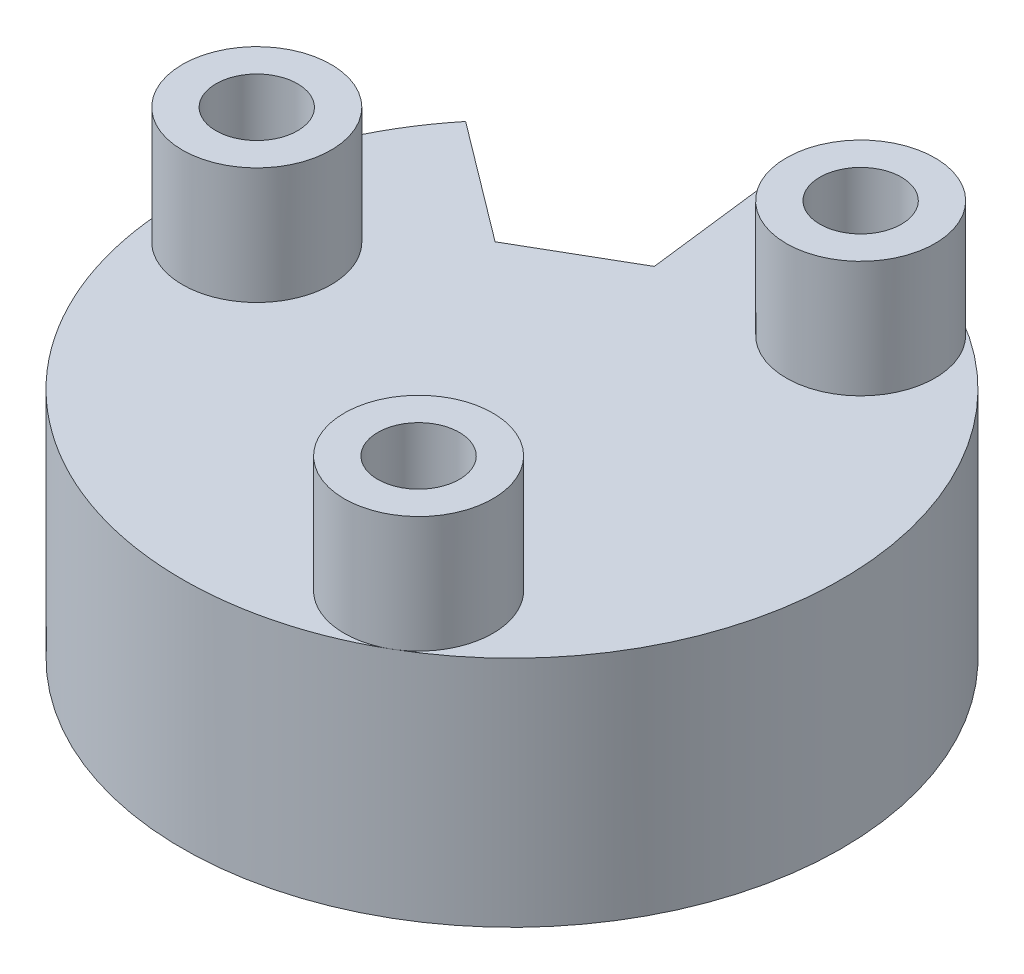
ISO-10303-21;
HEADER;
FILE_DESCRIPTION(('STEP AP214'),'2;1');
FILE_NAME('part.step','',(''),(''),'','','');
FILE_SCHEMA(('AUTOMOTIVE_DESIGN { 1 0 10303 214 1 1 1 1 }'));
ENDSEC;
DATA;
#1=APPLICATION_CONTEXT('core data for automotive mechanical design processes');
#2=APPLICATION_PROTOCOL_DEFINITION('international standard','automotive_design',2000,#1);
#3=PRODUCT_CONTEXT('',#1,'mechanical');
#4=PRODUCT('Part','Part','',(#3));
#5=PRODUCT_RELATED_PRODUCT_CATEGORY('part','',(#4));
#6=PRODUCT_DEFINITION_FORMATION('','',#4);
#7=PRODUCT_DEFINITION_CONTEXT('part definition',#1,'design');
#8=PRODUCT_DEFINITION('design','',#6,#7);
#9=PRODUCT_DEFINITION_SHAPE('','',#8);
#10=(LENGTH_UNIT() NAMED_UNIT(*) SI_UNIT(.MILLI.,.METRE.));
#11=(NAMED_UNIT(*) PLANE_ANGLE_UNIT() SI_UNIT($,.RADIAN.));
#12=(NAMED_UNIT(*) SI_UNIT($,.STERADIAN.) SOLID_ANGLE_UNIT());
#13=UNCERTAINTY_MEASURE_WITH_UNIT(LENGTH_MEASURE(1.E-05),#10,'distance_accuracy_value','');
#14=(GEOMETRIC_REPRESENTATION_CONTEXT(3) GLOBAL_UNCERTAINTY_ASSIGNED_CONTEXT((#13)) GLOBAL_UNIT_ASSIGNED_CONTEXT((#10,
#11,#12)) REPRESENTATION_CONTEXT('',''));
#15=CARTESIAN_POINT('',(0.,0.,0.));
#16=DIRECTION('',(0.,0.,1.));
#17=DIRECTION('',(1.,0.,0.));
#18=AXIS2_PLACEMENT_3D('',#15,#16,#17);
#19=CARTESIAN_POINT('',(0.,20.,0.));
#20=DIRECTION('',(0.,-1.,0.));
#21=DIRECTION('',(0.,0.,-1.));
#22=AXIS2_PLACEMENT_3D('',#19,#20,#21);
#23=CYLINDRICAL_SURFACE('',#22,28.275);
#24=CARTESIAN_POINT('',(0.,0.,0.));
#25=DIRECTION('',(0.,1.,0.));
#26=DIRECTION('',(0.,0.,1.));
#27=AXIS2_PLACEMENT_3D('',#24,#25,#26);
#28=CIRCLE('',#27,28.275);
#29=CARTESIAN_POINT('',(-21.8840547868726,0.,-17.9042947664843));
#30=VERTEX_POINT('',#29);
#31=CARTESIAN_POINT('',(-4.56354671118386,0.,-27.9042947664843));
#32=VERTEX_POINT('',#31);
#33=EDGE_CURVE('E153',#30,#32,#28,.T.);
#34=ORIENTED_EDGE('',*,*,#33,.T.);
#35=DIRECTION('',(0.,-1.,0.));
#36=VECTOR('',#35,1.);
#37=CARTESIAN_POINT('',(-4.56354671118386,20.,-27.9042947664843));
#38=LINE('',#37,#36);
#39=CARTESIAN_POINT('',(-4.56354671118386,20.,-27.9042947664843));
#40=VERTEX_POINT('',#39);
#41=EDGE_CURVE('E11',#40,#32,#38,.T.);
#42=ORIENTED_EDGE('',*,*,#41,.F.);
#43=CARTESIAN_POINT('',(0.,20.,0.));
#44=DIRECTION('',(0.,1.,0.));
#45=DIRECTION('',(0.,0.,1.));
#46=AXIS2_PLACEMENT_3D('',#43,#44,#45);
#47=CIRCLE('',#46,28.275);
#48=CARTESIAN_POINT('',(14.1375,20.,-24.486868292005));
#49=VERTEX_POINT('',#48);
#50=EDGE_CURVE('E184',#49,#40,#47,.T.);
#51=ORIENTED_EDGE('',*,*,#50,.F.);
#52=CARTESIAN_POINT('',(14.1375,20.,24.486868292005));
#53=VERTEX_POINT('',#52);
#54=EDGE_CURVE('E162',#53,#49,#47,.T.);
#55=ORIENTED_EDGE('',*,*,#54,.F.);
#56=CARTESIAN_POINT('',(-28.275,20.,0.));
#57=VERTEX_POINT('',#56);
#58=EDGE_CURVE('E161',#57,#53,#47,.T.);
#59=ORIENTED_EDGE('',*,*,#58,.F.);
#60=CARTESIAN_POINT('',(-21.8840547868726,20.,-17.9042947664843));
#61=VERTEX_POINT('',#60);
#62=EDGE_CURVE('E157',#61,#57,#47,.T.);
#63=ORIENTED_EDGE('',*,*,#62,.F.);
#64=DIRECTION('',(0.,-1.,0.));
#65=VECTOR('',#64,1.);
#66=CARTESIAN_POINT('',(-21.8840547868726,20.,-17.9042947664843));
#67=LINE('',#66,#65);
#68=EDGE_CURVE('E171',#61,#30,#67,.T.);
#69=ORIENTED_EDGE('',*,*,#68,.T.);
#70=EDGE_LOOP('',(#34,#42,#51,#55,#59,#63,#69));
#71=FACE_BOUND('',#70,.T.);
#72=ADVANCED_FACE('F45',(#71),#23,.T.);
#73=CARTESIAN_POINT('',(-4.56354671118386,20.,-27.9042947664843));
#74=DIRECTION('',(0.992655646154147,0.,-0.120974245847179));
#75=DIRECTION('',(-0.120974245847179,0.,-0.992655646154147));
#76=AXIS2_PLACEMENT_3D('',#73,#74,#75);
#77=PLANE('',#76);
#78=DIRECTION('',(0.120974245847179,0.,0.992655646154146));
#79=VECTOR('',#78,1.);
#80=CARTESIAN_POINT('',(-4.56354671118386,0.,-27.9042947664843));
#81=LINE('',#80,#79);
#82=CARTESIAN_POINT('',(-3.01877808660203,0.,-15.2286770227703));
#83=VERTEX_POINT('',#82);
#84=EDGE_CURVE('E175',#32,#83,#81,.T.);
#85=ORIENTED_EDGE('',*,*,#84,.T.);
#86=DIRECTION('',(0.,-1.,0.));
#87=VECTOR('',#86,1.);
#88=CARTESIAN_POINT('',(-3.01877808660203,20.,-15.2286770227703));
#89=LINE('',#88,#87);
#90=CARTESIAN_POINT('',(-3.01877808660203,20.,-15.2286770227703));
#91=VERTEX_POINT('',#90);
#92=EDGE_CURVE('E53',#91,#83,#89,.T.);
#93=ORIENTED_EDGE('',*,*,#92,.F.);
#94=DIRECTION('',(0.120974245847179,0.,0.992655646154146));
#95=VECTOR('',#94,1.);
#96=CARTESIAN_POINT('',(-4.56354671118386,20.,-27.9042947664843));
#97=LINE('',#96,#95);
#98=EDGE_CURVE('E160',#40,#91,#97,.T.);
#99=ORIENTED_EDGE('',*,*,#98,.F.);
#100=ORIENTED_EDGE('',*,*,#41,.T.);
#101=EDGE_LOOP('',(#85,#93,#99,#100));
#102=FACE_BOUND('',#101,.T.);
#103=ADVANCED_FACE('F220',(#102),#77,.F.);
#104=CARTESIAN_POINT('',(-11.6790321244464,20.,-10.2286770227703));
#105=DIRECTION('',(0.5,0.,0.866025403784439));
#106=DIRECTION('',(0.866025403784439,0.,-0.5));
#107=AXIS2_PLACEMENT_3D('',#104,#105,#106);
#108=PLANE('',#107);
#109=CARTESIAN_POINT('',(-7.34890510552423,5.,-12.7286770227703));
#110=DIRECTION('',(-0.5,0.,-0.866025403784438));
#111=DIRECTION('',(-0.866025403784439,0.,0.5));
#112=AXIS2_PLACEMENT_3D('',#109,#110,#111);
#113=CIRCLE('',#112,1.65);
#114=CARTESIAN_POINT('',(-8.77784702176855,5.,-11.9036770227703));
#115=VERTEX_POINT('',#114);
#116=EDGE_CURVE('E448',#115,#115,#113,.T.);
#117=ORIENTED_EDGE('',*,*,#116,.F.);
#118=EDGE_LOOP('',(#117));
#119=FACE_BOUND('',#118,.T.);
#120=DIRECTION('',(-0.866025403784439,0.,0.5));
#121=VECTOR('',#120,1.);
#122=CARTESIAN_POINT('',(-11.6790321244464,0.,-10.2286770227703));
#123=LINE('',#122,#121);
#124=CARTESIAN_POINT('',(-11.6790321244464,0.,-10.2286770227703));
#125=VERTEX_POINT('',#124);
#126=EDGE_CURVE('E178',#83,#125,#123,.T.);
#127=ORIENTED_EDGE('',*,*,#126,.T.);
#128=DIRECTION('',(0.,-1.,0.));
#129=VECTOR('',#128,1.);
#130=CARTESIAN_POINT('',(-11.6790321244464,20.,-10.2286770227703));
#131=LINE('',#130,#129);
#132=CARTESIAN_POINT('',(-11.6790321244464,20.,-10.2286770227703));
#133=VERTEX_POINT('',#132);
#134=EDGE_CURVE('E188',#133,#125,#131,.T.);
#135=ORIENTED_EDGE('',*,*,#134,.F.);
#136=DIRECTION('',(-0.866025403784439,0.,0.5));
#137=VECTOR('',#136,1.);
#138=CARTESIAN_POINT('',(-11.6790321244464,20.,-10.2286770227703));
#139=LINE('',#138,#137);
#140=EDGE_CURVE('E165',#91,#133,#139,.T.);
#141=ORIENTED_EDGE('',*,*,#140,.F.);
#142=ORIENTED_EDGE('',*,*,#92,.T.);
#143=EDGE_LOOP('',(#127,#135,#141,#142));
#144=FACE_BOUND('',#143,.T.);
#145=ADVANCED_FACE('F197',(#119,#144),#108,.F.);
#146=CARTESIAN_POINT('',(-21.8840547868726,20.,-17.9042947664843));
#147=DIRECTION('',(-0.601094593184395,0.,0.799177883855958));
#148=DIRECTION('',(0.799177883855958,0.,0.601094593184395));
#149=AXIS2_PLACEMENT_3D('',#146,#147,#148);
#150=PLANE('',#149);
#151=DIRECTION('',(-0.799177883855958,0.,-0.601094593184395));
#152=VECTOR('',#151,1.);
#153=CARTESIAN_POINT('',(-21.8840547868726,0.,-17.9042947664843));
#154=LINE('',#153,#152);
#155=EDGE_CURVE('E181',#125,#30,#154,.T.);
#156=ORIENTED_EDGE('',*,*,#155,.T.);
#157=ORIENTED_EDGE('',*,*,#68,.F.);
#158=DIRECTION('',(-0.799177883855958,0.,-0.601094593184395));
#159=VECTOR('',#158,1.);
#160=CARTESIAN_POINT('',(-21.8840547868726,20.,-17.9042947664843));
#161=LINE('',#160,#159);
#162=EDGE_CURVE('E168',#133,#61,#161,.T.);
#163=ORIENTED_EDGE('',*,*,#162,.F.);
#164=ORIENTED_EDGE('',*,*,#134,.T.);
#165=EDGE_LOOP('',(#156,#157,#163,#164));
#166=FACE_BOUND('',#165,.T.);
#167=ADVANCED_FACE('F207',(#166),#150,.F.);
#168=CARTESIAN_POINT('',(0.,20.,0.));
#169=DIRECTION('',(0.,1.,0.));
#170=DIRECTION('',(0.,0.,1.));
#171=AXIS2_PLACEMENT_3D('',#168,#169,#170);
#172=PLANE('',#171);
#173=ORIENTED_EDGE('',*,*,#58,.T.);
#174=CARTESIAN_POINT('',(10.95,20.,18.9659563428792));
#175=DIRECTION('',(0.,1.,0.));
#176=DIRECTION('',(0.,0.,1.));
#177=AXIS2_PLACEMENT_3D('',#174,#175,#176);
#178=CIRCLE('',#177,6.375);
#179=EDGE_CURVE('E66',#53,#53,#178,.T.);
#180=ORIENTED_EDGE('',*,*,#179,.F.);
#181=ORIENTED_EDGE('',*,*,#54,.T.);
#182=CARTESIAN_POINT('',(10.95,20.,-18.9659563428792));
#183=DIRECTION('',(0.,1.,0.));
#184=DIRECTION('',(0.,0.,1.));
#185=AXIS2_PLACEMENT_3D('',#182,#183,#184);
#186=CIRCLE('',#185,6.375);
#187=EDGE_CURVE('E141',#49,#49,#186,.T.);
#188=ORIENTED_EDGE('',*,*,#187,.F.);
#189=ORIENTED_EDGE('',*,*,#50,.T.);
#190=ORIENTED_EDGE('',*,*,#98,.T.);
#191=ORIENTED_EDGE('',*,*,#140,.T.);
#192=ORIENTED_EDGE('',*,*,#162,.T.);
#193=ORIENTED_EDGE('',*,*,#62,.T.);
#194=CARTESIAN_POINT('',(-21.9,20.,0.));
#195=DIRECTION('',(0.,1.,0.));
#196=DIRECTION('',(0.,0.,1.));
#197=AXIS2_PLACEMENT_3D('',#194,#195,#196);
#198=CIRCLE('',#197,6.375);
#199=EDGE_CURVE('E145',#57,#57,#198,.T.);
#200=ORIENTED_EDGE('',*,*,#199,.F.);
#201=EDGE_LOOP('',(#173,#180,#181,#188,#189,#190,#191,#192,#193,#200));
#202=FACE_BOUND('',#201,.T.);
#203=ADVANCED_FACE('F217',(#202),#172,.T.);
#204=CARTESIAN_POINT('',(0.,0.,0.));
#205=DIRECTION('',(0.,1.,0.));
#206=DIRECTION('',(0.,0.,1.));
#207=AXIS2_PLACEMENT_3D('',#204,#205,#206);
#208=PLANE('',#207);
#209=CARTESIAN_POINT('',(10.95,0.,-18.9659563428792));
#210=DIRECTION('',(0.,1.,0.));
#211=DIRECTION('',(0.,0.,1.));
#212=AXIS2_PLACEMENT_3D('',#209,#210,#211);
#213=CIRCLE('',#212,3.49999999999999);
#214=CARTESIAN_POINT('',(10.95,0.,-15.4659563428792));
#215=VERTEX_POINT('',#214);
#216=EDGE_CURVE('E458',#215,#215,#213,.T.);
#217=ORIENTED_EDGE('',*,*,#216,.T.);
#218=EDGE_LOOP('',(#217));
#219=FACE_BOUND('',#218,.T.);
#220=CARTESIAN_POINT('',(10.95,0.,18.9659563428792));
#221=DIRECTION('',(0.,1.,0.));
#222=DIRECTION('',(0.,0.,1.));
#223=AXIS2_PLACEMENT_3D('',#220,#221,#222);
#224=CIRCLE('',#223,3.49999999999999);
#225=CARTESIAN_POINT('',(10.95,0.,22.4659563428792));
#226=VERTEX_POINT('',#225);
#227=EDGE_CURVE('E466',#226,#226,#224,.T.);
#228=ORIENTED_EDGE('',*,*,#227,.T.);
#229=EDGE_LOOP('',(#228));
#230=FACE_BOUND('',#229,.T.);
#231=CARTESIAN_POINT('',(-21.9,0.,0.));
#232=DIRECTION('',(0.,1.,0.));
#233=DIRECTION('',(0.,0.,1.));
#234=AXIS2_PLACEMENT_3D('',#231,#232,#233);
#235=CIRCLE('',#234,3.49999999999999);
#236=CARTESIAN_POINT('',(-21.9,0.,3.49999999999999));
#237=VERTEX_POINT('',#236);
#238=EDGE_CURVE('E129',#237,#237,#235,.T.);
#239=ORIENTED_EDGE('',*,*,#238,.T.);
#240=EDGE_LOOP('',(#239));
#241=FACE_BOUND('',#240,.T.);
#242=DIRECTION('',(0.866025403784439,0.,-0.5));
#243=VECTOR('',#242,1.);
#244=CARTESIAN_POINT('',(0.90407823836161,0.,-4.10154148326223));
#245=LINE('',#244,#243);
#246=CARTESIAN_POINT('',(-4.00407823836161,0.,-1.26781602020128));
#247=VERTEX_POINT('',#246);
#248=CARTESIAN_POINT('',(0.90407823836161,0.,-4.10154148326223));
#249=VERTEX_POINT('',#248);
#250=EDGE_CURVE('E120',#247,#249,#245,.T.);
#251=ORIENTED_EDGE('',*,*,#250,.F.);
#252=CARTESIAN_POINT('',(0.,0.,0.));
#253=DIRECTION('',(0.,-1.,0.));
#254=DIRECTION('',(0.,0.,-1.));
#255=AXIS2_PLACEMENT_3D('',#252,#253,#254);
#256=CIRCLE('',#255,4.2);
#257=EDGE_CURVE('E60',#249,#247,#256,.T.);
#258=ORIENTED_EDGE('',*,*,#257,.F.);
#259=EDGE_LOOP('',(#251,#258));
#260=FACE_BOUND('',#259,.T.);
#261=ORIENTED_EDGE('',*,*,#33,.F.);
#262=ORIENTED_EDGE('',*,*,#155,.F.);
#263=ORIENTED_EDGE('',*,*,#126,.F.);
#264=ORIENTED_EDGE('',*,*,#84,.F.);
#265=EDGE_LOOP('',(#261,#262,#263,#264));
#266=FACE_BOUND('',#265,.T.);
#267=ADVANCED_FACE('F204',(#219,#230,#241,#260,#266),#208,.F.);
#268=CARTESIAN_POINT('',(-21.9,30.,0.));
#269=DIRECTION('',(0.,-1.,0.));
#270=DIRECTION('',(0.,0.,-1.));
#271=AXIS2_PLACEMENT_3D('',#268,#269,#270);
#272=CYLINDRICAL_SURFACE('',#271,6.375);
#273=CARTESIAN_POINT('',(-21.9,30.,0.));
#274=DIRECTION('',(0.,1.,0.));
#275=DIRECTION('',(0.,0.,1.));
#276=AXIS2_PLACEMENT_3D('',#273,#274,#275);
#277=CIRCLE('',#276,6.375);
#278=CARTESIAN_POINT('',(-21.9,30.,6.375));
#279=VERTEX_POINT('',#278);
#280=EDGE_CURVE('E149',#279,#279,#277,.T.);
#281=ORIENTED_EDGE('',*,*,#280,.F.);
#282=EDGE_LOOP('',(#281));
#283=FACE_BOUND('',#282,.T.);
#284=ORIENTED_EDGE('',*,*,#199,.T.);
#285=EDGE_LOOP('',(#284));
#286=FACE_BOUND('',#285,.T.);
#287=ADVANCED_FACE('F238',(#283,#286),#272,.T.);
#288=CARTESIAN_POINT('',(-21.9,30.,0.));
#289=DIRECTION('',(0.,1.,0.));
#290=DIRECTION('',(0.,0.,1.));
#291=AXIS2_PLACEMENT_3D('',#288,#289,#290);
#292=PLANE('',#291);
#293=CARTESIAN_POINT('',(-21.9,30.,0.));
#294=DIRECTION('',(0.,1.,0.));
#295=DIRECTION('',(0.,0.,1.));
#296=AXIS2_PLACEMENT_3D('',#293,#294,#295);
#297=CIRCLE('',#296,3.5);
#298=CARTESIAN_POINT('',(-21.9,30.,3.5));
#299=VERTEX_POINT('',#298);
#300=EDGE_CURVE('E470',#299,#299,#297,.T.);
#301=ORIENTED_EDGE('',*,*,#300,.F.);
#302=EDGE_LOOP('',(#301));
#303=FACE_BOUND('',#302,.T.);
#304=ORIENTED_EDGE('',*,*,#280,.T.);
#305=EDGE_LOOP('',(#304));
#306=FACE_BOUND('',#305,.T.);
#307=ADVANCED_FACE('F228',(#303,#306),#292,.T.);
#308=CARTESIAN_POINT('',(10.95,30.,-18.9659563428792));
#309=DIRECTION('',(0.,-1.,0.));
#310=DIRECTION('',(0.,0.,-1.));
#311=AXIS2_PLACEMENT_3D('',#308,#309,#310);
#312=CYLINDRICAL_SURFACE('',#311,6.375);
#313=CARTESIAN_POINT('',(10.95,30.,-18.9659563428792));
#314=DIRECTION('',(0.,1.,0.));
#315=DIRECTION('',(0.,0.,1.));
#316=AXIS2_PLACEMENT_3D('',#313,#314,#315);
#317=CIRCLE('',#316,6.375);
#318=CARTESIAN_POINT('',(10.95,30.,-12.5909563428792));
#319=VERTEX_POINT('',#318);
#320=EDGE_CURVE('E137',#319,#319,#317,.T.);
#321=ORIENTED_EDGE('',*,*,#320,.F.);
#322=EDGE_LOOP('',(#321));
#323=FACE_BOUND('',#322,.T.);
#324=ORIENTED_EDGE('',*,*,#187,.T.);
#325=EDGE_LOOP('',(#324));
#326=FACE_BOUND('',#325,.T.);
#327=ADVANCED_FACE('F225',(#323,#326),#312,.T.);
#328=CARTESIAN_POINT('',(10.95,30.,-18.9659563428792));
#329=DIRECTION('',(0.,1.,0.));
#330=DIRECTION('',(0.,0.,1.));
#331=AXIS2_PLACEMENT_3D('',#328,#329,#330);
#332=PLANE('',#331);
#333=CARTESIAN_POINT('',(10.95,30.,-18.9659563428792));
#334=DIRECTION('',(0.,1.,0.));
#335=DIRECTION('',(0.,0.,1.));
#336=AXIS2_PLACEMENT_3D('',#333,#334,#335);
#337=CIRCLE('',#336,3.5);
#338=CARTESIAN_POINT('',(10.95,30.,-15.4659563428792));
#339=VERTEX_POINT('',#338);
#340=EDGE_CURVE('E452',#339,#339,#337,.T.);
#341=ORIENTED_EDGE('',*,*,#340,.F.);
#342=EDGE_LOOP('',(#341));
#343=FACE_BOUND('',#342,.T.);
#344=ORIENTED_EDGE('',*,*,#320,.T.);
#345=EDGE_LOOP('',(#344));
#346=FACE_BOUND('',#345,.T.);
#347=ADVANCED_FACE('F227',(#343,#346),#332,.T.);
#348=CARTESIAN_POINT('',(10.95,30.,18.9659563428792));
#349=DIRECTION('',(0.,-1.,0.));
#350=DIRECTION('',(0.,0.,-1.));
#351=AXIS2_PLACEMENT_3D('',#348,#349,#350);
#352=CYLINDRICAL_SURFACE('',#351,6.375);
#353=CARTESIAN_POINT('',(10.95,30.,18.9659563428792));
#354=DIRECTION('',(0.,1.,0.));
#355=DIRECTION('',(0.,0.,1.));
#356=AXIS2_PLACEMENT_3D('',#353,#354,#355);
#357=CIRCLE('',#356,6.375);
#358=CARTESIAN_POINT('',(10.95,30.,25.3409563428792));
#359=VERTEX_POINT('',#358);
#360=EDGE_CURVE('E133',#359,#359,#357,.T.);
#361=ORIENTED_EDGE('',*,*,#360,.F.);
#362=EDGE_LOOP('',(#361));
#363=FACE_BOUND('',#362,.T.);
#364=ORIENTED_EDGE('',*,*,#179,.T.);
#365=EDGE_LOOP('',(#364));
#366=FACE_BOUND('',#365,.T.);
#367=ADVANCED_FACE('F235',(#363,#366),#352,.T.);
#368=CARTESIAN_POINT('',(10.95,30.,18.9659563428792));
#369=DIRECTION('',(0.,1.,0.));
#370=DIRECTION('',(0.,0.,1.));
#371=AXIS2_PLACEMENT_3D('',#368,#369,#370);
#372=PLANE('',#371);
#373=CARTESIAN_POINT('',(10.95,30.,18.9659563428792));
#374=DIRECTION('',(0.,1.,0.));
#375=DIRECTION('',(0.,0.,1.));
#376=AXIS2_PLACEMENT_3D('',#373,#374,#375);
#377=CIRCLE('',#376,3.5);
#378=CARTESIAN_POINT('',(10.95,30.,22.4659563428792));
#379=VERTEX_POINT('',#378);
#380=EDGE_CURVE('E462',#379,#379,#377,.T.);
#381=ORIENTED_EDGE('',*,*,#380,.F.);
#382=EDGE_LOOP('',(#381));
#383=FACE_BOUND('',#382,.T.);
#384=ORIENTED_EDGE('',*,*,#360,.T.);
#385=EDGE_LOOP('',(#384));
#386=FACE_BOUND('',#385,.T.);
#387=ADVANCED_FACE('F293',(#383,#386),#372,.T.);
#388=CARTESIAN_POINT('',(0.,12.,0.));
#389=DIRECTION('',(0.,-1.,0.));
#390=DIRECTION('',(0.,0.,-1.));
#391=AXIS2_PLACEMENT_3D('',#388,#389,#390);
#392=CYLINDRICAL_SURFACE('',#391,4.2);
#393=ORIENTED_EDGE('',*,*,#257,.T.);
#394=DIRECTION('',(0.,-1.,0.));
#395=VECTOR('',#394,1.);
#396=CARTESIAN_POINT('',(-4.00407823836161,12.,-1.26781602020128));
#397=LINE('',#396,#395);
#398=CARTESIAN_POINT('',(-4.00407823836161,12.,-1.26781602020128));
#399=VERTEX_POINT('',#398);
#400=EDGE_CURVE('E104',#399,#247,#397,.T.);
#401=ORIENTED_EDGE('',*,*,#400,.F.);
#402=CARTESIAN_POINT('',(0.,12.,0.));
#403=DIRECTION('',(0.,-1.,0.));
#404=DIRECTION('',(0.,0.,-1.));
#405=AXIS2_PLACEMENT_3D('',#402,#403,#404);
#406=CIRCLE('',#405,4.2);
#407=CARTESIAN_POINT('',(0.90407823836161,12.,-4.10154148326223));
#408=VERTEX_POINT('',#407);
#409=EDGE_CURVE('E107',#408,#399,#406,.T.);
#410=ORIENTED_EDGE('',*,*,#409,.F.);
#411=DIRECTION('',(0.,-1.,0.));
#412=VECTOR('',#411,1.);
#413=CARTESIAN_POINT('',(0.90407823836161,12.,-4.10154148326223));
#414=LINE('',#413,#412);
#415=EDGE_CURVE('E114',#408,#249,#414,.T.);
#416=ORIENTED_EDGE('',*,*,#415,.T.);
#417=EDGE_LOOP('',(#393,#401,#410,#416));
#418=FACE_BOUND('',#417,.T.);
#419=ADVANCED_FACE('F106',(#418),#392,.F.);
#420=CARTESIAN_POINT('',(0.90407823836161,12.,-4.10154148326223));
#421=DIRECTION('',(-0.5,0.,-0.866025403784438));
#422=DIRECTION('',(-0.866025403784439,0.,0.5));
#423=AXIS2_PLACEMENT_3D('',#420,#421,#422);
#424=PLANE('',#423);
#425=CARTESIAN_POINT('',(-1.55,5.,-2.68467875173176));
#426=DIRECTION('',(-0.5,0.,-0.866025403784438));
#427=DIRECTION('',(-0.866025403784439,0.,0.5));
#428=AXIS2_PLACEMENT_3D('',#425,#426,#427);
#429=CIRCLE('',#428,1.65);
#430=CARTESIAN_POINT('',(-2.97894191624432,5.,-1.85967875173176));
#431=VERTEX_POINT('',#430);
#432=EDGE_CURVE('E445',#431,#431,#429,.T.);
#433=ORIENTED_EDGE('',*,*,#432,.T.);
#434=EDGE_LOOP('',(#433));
#435=FACE_BOUND('',#434,.T.);
#436=ORIENTED_EDGE('',*,*,#250,.T.);
#437=ORIENTED_EDGE('',*,*,#415,.F.);
#438=DIRECTION('',(0.866025403784439,0.,-0.5));
#439=VECTOR('',#438,1.);
#440=CARTESIAN_POINT('',(0.90407823836161,12.,-4.10154148326223));
#441=LINE('',#440,#439);
#442=EDGE_CURVE('E115',#399,#408,#441,.T.);
#443=ORIENTED_EDGE('',*,*,#442,.F.);
#444=ORIENTED_EDGE('',*,*,#400,.T.);
#445=EDGE_LOOP('',(#436,#437,#443,#444));
#446=FACE_BOUND('',#445,.T.);
#447=ADVANCED_FACE('F122',(#435,#446),#424,.F.);
#448=CARTESIAN_POINT('',(0.,12.,0.));
#449=DIRECTION('',(0.,-1.,0.));
#450=DIRECTION('',(0.,0.,-1.));
#451=AXIS2_PLACEMENT_3D('',#448,#449,#450);
#452=PLANE('',#451);
#453=ORIENTED_EDGE('',*,*,#409,.T.);
#454=ORIENTED_EDGE('',*,*,#442,.T.);
#455=EDGE_LOOP('',(#453,#454));
#456=FACE_BOUND('',#455,.T.);
#457=ADVANCED_FACE('F118',(#456),#452,.T.);
#458=CARTESIAN_POINT('',(-21.9,30.,0.));
#459=DIRECTION('',(0.,1.,0.));
#460=DIRECTION('',(0.,0.,1.));
#461=AXIS2_PLACEMENT_3D('',#458,#459,#460);
#462=CYLINDRICAL_SURFACE('',#461,3.49999999999999);
#463=ORIENTED_EDGE('',*,*,#238,.F.);
#464=EDGE_LOOP('',(#463));
#465=FACE_BOUND('',#464,.T.);
#466=ORIENTED_EDGE('',*,*,#300,.T.);
#467=EDGE_LOOP('',(#466));
#468=FACE_BOUND('',#467,.T.);
#469=ADVANCED_FACE('F305',(#465,#468),#462,.F.);
#470=CARTESIAN_POINT('',(10.95,30.,18.9659563428792));
#471=DIRECTION('',(0.,1.,0.));
#472=DIRECTION('',(0.,0.,1.));
#473=AXIS2_PLACEMENT_3D('',#470,#471,#472);
#474=CYLINDRICAL_SURFACE('',#473,3.49999999999999);
#475=ORIENTED_EDGE('',*,*,#227,.F.);
#476=EDGE_LOOP('',(#475));
#477=FACE_BOUND('',#476,.T.);
#478=ORIENTED_EDGE('',*,*,#380,.T.);
#479=EDGE_LOOP('',(#478));
#480=FACE_BOUND('',#479,.T.);
#481=ADVANCED_FACE('F310',(#477,#480),#474,.F.);
#482=CARTESIAN_POINT('',(10.95,30.,-18.9659563428792));
#483=DIRECTION('',(0.,1.,0.));
#484=DIRECTION('',(0.,0.,1.));
#485=AXIS2_PLACEMENT_3D('',#482,#483,#484);
#486=CYLINDRICAL_SURFACE('',#485,3.49999999999999);
#487=ORIENTED_EDGE('',*,*,#216,.F.);
#488=EDGE_LOOP('',(#487));
#489=FACE_BOUND('',#488,.T.);
#490=ORIENTED_EDGE('',*,*,#340,.T.);
#491=EDGE_LOOP('',(#490));
#492=FACE_BOUND('',#491,.T.);
#493=ADVANCED_FACE('F323',(#489,#492),#486,.F.);
#494=CARTESIAN_POINT('',(-7.34890510552423,5.,-12.7286770227703));
#495=DIRECTION('',(-0.5,0.,-0.866025403784438));
#496=DIRECTION('',(-0.866025403784439,0.,0.5));
#497=AXIS2_PLACEMENT_3D('',#494,#495,#496);
#498=CYLINDRICAL_SURFACE('',#497,1.65);
#499=CARTESIAN_POINT('',(-2.97894191624432,5.,-1.85967875173176));
#500=CARTESIAN_POINT('',(-3.0393471777602,5.,-1.96430373372174));
#501=CARTESIAN_POINT('',(-3.09975243927607,5.,-2.06892871571173));
#502=CARTESIAN_POINT('',(-3.22056296230783,5.,-2.2781786796917));
#503=CARTESIAN_POINT('',(-3.28096822382371,5.,-2.38280366168168));
#504=CARTESIAN_POINT('',(-3.40177874685546,5.,-2.59205362566165));
#505=CARTESIAN_POINT('',(-3.46218400837134,5.,-2.69667860765163));
#506=CARTESIAN_POINT('',(-3.58299453140309,5.,-2.9059285716316));
#507=CARTESIAN_POINT('',(-3.64339979291897,5.,-3.01055355362159));
#508=CARTESIAN_POINT('',(-3.76421031595073,5.,-3.21980351760156));
#509=CARTESIAN_POINT('',(-3.8246155774666,5.,-3.32442849959154));
#510=CARTESIAN_POINT('',(-3.94542610049836,5.,-3.53367846357151));
#511=CARTESIAN_POINT('',(-4.00583136201424,5.,-3.6383034455615));
#512=CARTESIAN_POINT('',(-4.12664188504599,5.,-3.84755340954146));
#513=CARTESIAN_POINT('',(-4.18704714656187,5.,-3.95217839153145));
#514=CARTESIAN_POINT('',(-4.30785766959362,5.,-4.16142835551142));
#515=CARTESIAN_POINT('',(-4.3682629311095,5.,-4.2660533375014));
#516=CARTESIAN_POINT('',(-4.48907345414125,5.,-4.47530330148137));
#517=CARTESIAN_POINT('',(-4.54947871565713,5.,-4.57992828347136));
#518=CARTESIAN_POINT('',(-4.67028923868889,5.,-4.78917824745133));
#519=CARTESIAN_POINT('',(-4.73069450020476,5.,-4.89380322944131));
#520=CARTESIAN_POINT('',(-4.85150502323652,5.,-5.10305319342128));
#521=CARTESIAN_POINT('',(-4.9119102847524,5.,-5.20767817541126));
#522=CARTESIAN_POINT('',(-5.03272080778415,5.,-5.41692813939123));
#523=CARTESIAN_POINT('',(-5.09312606930003,5.,-5.52155312138122));
#524=CARTESIAN_POINT('',(-5.21393659233178,5.,-5.73080308536119));
#525=CARTESIAN_POINT('',(-5.27434185384766,5.,-5.83542806735117));
#526=CARTESIAN_POINT('',(-5.39515237687942,5.,-6.04467803133114));
#527=CARTESIAN_POINT('',(-5.45555763839529,5.,-6.14930301332113));
#528=CARTESIAN_POINT('',(-5.57636816142705,5.,-6.35855297730109));
#529=CARTESIAN_POINT('',(-5.63677342294293,5.,-6.46317795929108));
#530=CARTESIAN_POINT('',(-5.75758394597468,5.,-6.67242792327105));
#531=CARTESIAN_POINT('',(-5.81798920749056,5.,-6.77705290526103));
#532=CARTESIAN_POINT('',(-5.93879973052231,5.,-6.986302869241));
#533=CARTESIAN_POINT('',(-5.99920499203819,5.,-7.09092785123099));
#534=CARTESIAN_POINT('',(-6.12001551506994,5.,-7.30017781521096));
#535=CARTESIAN_POINT('',(-6.18042077658582,5.,-7.40480279720094));
#536=CARTESIAN_POINT('',(-6.30123129961758,5.,-7.61405276118091));
#537=CARTESIAN_POINT('',(-6.36163656113345,5.,-7.7186777431709));
#538=CARTESIAN_POINT('',(-6.48244708416521,5.,-7.92792770715087));
#539=CARTESIAN_POINT('',(-6.54285234568109,5.,-8.03255268914085));
#540=CARTESIAN_POINT('',(-6.66366286871284,5.,-8.24180265312082));
#541=CARTESIAN_POINT('',(-6.72406813022872,5.,-8.3464276351108));
#542=CARTESIAN_POINT('',(-6.84487865326047,5.,-8.55567759909077));
#543=CARTESIAN_POINT('',(-6.90528391477635,5.,-8.66030258108076));
#544=CARTESIAN_POINT('',(-7.0260944378081,5.,-8.86955254506072));
#545=CARTESIAN_POINT('',(-7.08649969932398,5.,-8.97417752705071));
#546=CARTESIAN_POINT('',(-7.20731022235574,5.,-9.18342749103068));
#547=CARTESIAN_POINT('',(-7.26771548387161,5.,-9.28805247302066));
#548=CARTESIAN_POINT('',(-7.38852600690337,5.,-9.49730243700063));
#549=CARTESIAN_POINT('',(-7.44893126841925,5.,-9.60192741899062));
#550=CARTESIAN_POINT('',(-7.569741791451,5.,-9.81117738297059));
#551=CARTESIAN_POINT('',(-7.63014705296688,5.,-9.91580236496057));
#552=CARTESIAN_POINT('',(-7.75095757599863,5.,-10.1250523289405));
#553=CARTESIAN_POINT('',(-7.81136283751451,5.,-10.2296773109305));
#554=CARTESIAN_POINT('',(-7.93217336054627,5.,-10.4389272749105));
#555=CARTESIAN_POINT('',(-7.99257862206214,5.,-10.5435522569005));
#556=CARTESIAN_POINT('',(-8.1133891450939,5.,-10.7528022208804));
#557=CARTESIAN_POINT('',(-8.17379440660978,5.,-10.8574272028704));
#558=CARTESIAN_POINT('',(-8.29460492964153,5.,-11.0666771668504));
#559=CARTESIAN_POINT('',(-8.35501019115741,5.,-11.1713021488404));
#560=CARTESIAN_POINT('',(-8.47582071418916,5.,-11.3805521128204));
#561=CARTESIAN_POINT('',(-8.53622597570504,5.,-11.4851770948103));
#562=CARTESIAN_POINT('',(-8.6570364987368,5.,-11.6944270587903));
#563=CARTESIAN_POINT('',(-8.71744176025267,5.,-11.7990520407803));
#564=CARTESIAN_POINT('',(-8.77784702176855,5.,-11.9036770227703));
#565=B_SPLINE_CURVE_WITH_KNOTS('',3,(#499,#500,#501,#502,#503,#504,#505,#506,#507,#508,#509,
#510,#511,#512,#513,#514,#515,#516,#517,#518,#519,#520,#521,#522,#523,#524,#525,#526,#527,#528,
#529,#530,#531,#532,#533,#534,#535,#536,#537,#538,#539,#540,#541,#542,#543,#544,#545,#546,#547,
#548,#549,#550,#551,#552,#553,#554,#555,#556,#557,#558,#559,#560,#561,#562,#563,#564),
.UNSPECIFIED.,.F.,.F.,(4,2,2,2,2,2,2,2,2,2,2,2,2,2,2,2,2,2,2,2,2,2,2,2,2,2,2,2,2,2,2,2,4),(0.,
0.362431569095264,0.724863138190528,1.08729470728579,1.44972627638106,1.81215784547632,
2.17458941457159,2.53702098366685,2.89945255276211,3.26188412185738,3.62431569095264,
3.98674726004791,4.34917882914317,4.71161039823844,5.0740419673337,5.43647353642896,
5.79890510552423,6.16133667461949,6.52376824371476,6.88619981281002,7.24863138190529,
7.61106295100055,7.97349452009581,8.33592608919108,8.69835765828634,9.0607892273816,
9.42322079647687,9.78565236557213,10.1480839346674,10.5105155037627,10.8729470728579,
11.2353786419532,11.5978102110485),.UNSPECIFIED.);
#566=EDGE_CURVE('BSEAM334',#431,#115,#565,.T.);
#567=ORIENTED_EDGE('',*,*,#432,.F.);
#568=ORIENTED_EDGE('',*,*,#116,.T.);
#569=ORIENTED_EDGE('',*,*,#566,.T.);
#570=ORIENTED_EDGE('',*,*,#566,.F.);
#571=EDGE_LOOP('',(#567,#569,#568,#570));
#572=FACE_BOUND('',#571,.T.);
#573=ADVANCED_FACE('F334',(#572),#498,.F.);
#574=CLOSED_SHELL('',(#72,#103,#145,#167,#203,#267,#287,#307,#327,#347,#367,#387,#419,#447,#457,
#469,#481,#493,#573));
#575=MANIFOLD_SOLID_BREP('B2',#574);
#576=ADVANCED_BREP_SHAPE_REPRESENTATION('',(#18,#575),#14);
#577=SHAPE_DEFINITION_REPRESENTATION(#9,#576);
ENDSEC;
END-ISO-10303-21;
